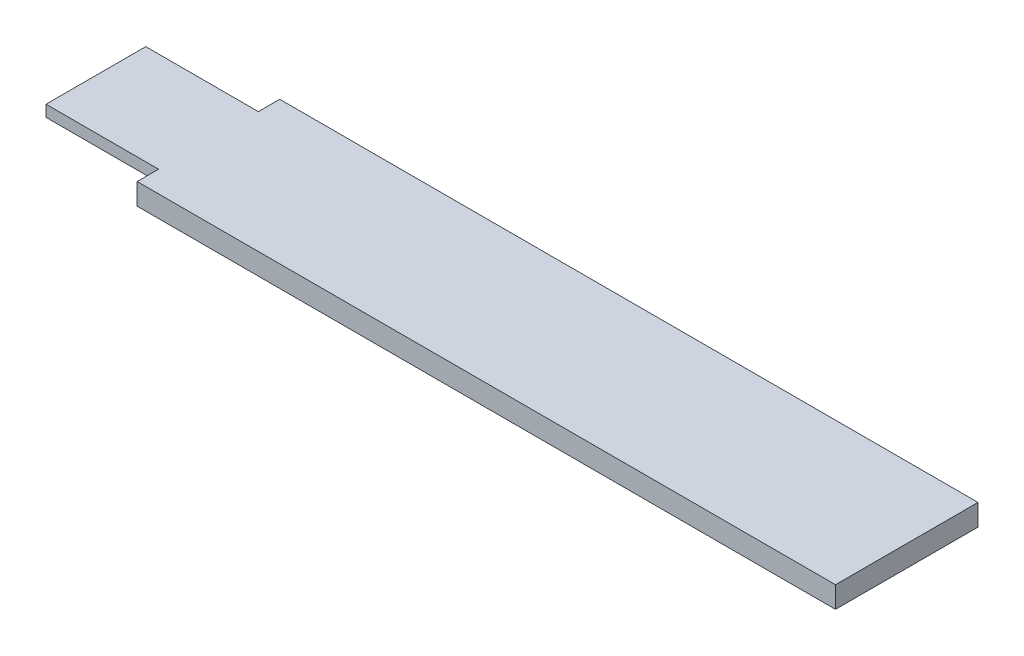
ISO-10303-21;
HEADER;
FILE_DESCRIPTION(('STEP AP214'),'2;1');
FILE_NAME('part.step','',(''),(''),'','','');
FILE_SCHEMA(('AUTOMOTIVE_DESIGN { 1 0 10303 214 1 1 1 1 }'));
ENDSEC;
DATA;
#1=APPLICATION_CONTEXT('core data for automotive mechanical design processes');
#2=APPLICATION_PROTOCOL_DEFINITION('international standard','automotive_design',2000,#1);
#3=PRODUCT_CONTEXT('',#1,'mechanical');
#4=PRODUCT('Part','Part','',(#3));
#5=PRODUCT_RELATED_PRODUCT_CATEGORY('part','',(#4));
#6=PRODUCT_DEFINITION_FORMATION('','',#4);
#7=PRODUCT_DEFINITION_CONTEXT('part definition',#1,'design');
#8=PRODUCT_DEFINITION('design','',#6,#7);
#9=PRODUCT_DEFINITION_SHAPE('','',#8);
#10=(LENGTH_UNIT() NAMED_UNIT(*) SI_UNIT(.MILLI.,.METRE.));
#11=(NAMED_UNIT(*) PLANE_ANGLE_UNIT() SI_UNIT($,.RADIAN.));
#12=(NAMED_UNIT(*) SI_UNIT($,.STERADIAN.) SOLID_ANGLE_UNIT());
#13=UNCERTAINTY_MEASURE_WITH_UNIT(LENGTH_MEASURE(1.E-05),#10,'distance_accuracy_value','');
#14=(GEOMETRIC_REPRESENTATION_CONTEXT(3) GLOBAL_UNCERTAINTY_ASSIGNED_CONTEXT((#13)) GLOBAL_UNIT_ASSIGNED_CONTEXT((#10,
#11,#12)) REPRESENTATION_CONTEXT('',''));
#15=CARTESIAN_POINT('',(0.,0.,0.));
#16=DIRECTION('',(0.,0.,1.));
#17=DIRECTION('',(1.,0.,0.));
#18=AXIS2_PLACEMENT_3D('',#15,#16,#17);
#19=CARTESIAN_POINT('',(-235.,15.,-35.));
#20=DIRECTION('',(0.,0.,1.));
#21=DIRECTION('',(1.,0.,0.));
#22=AXIS2_PLACEMENT_3D('',#19,#20,#21);
#23=PLANE('',#22);
#24=DIRECTION('',(0.,-1.,0.));
#25=VECTOR('',#24,1.);
#26=CARTESIAN_POINT('',(-235.,15.,-35.));
#27=LINE('',#26,#25);
#28=CARTESIAN_POINT('',(-235.,6.99999999999999,-35.));
#29=VERTEX_POINT('',#28);
#30=CARTESIAN_POINT('',(-235.,0.,-35.));
#31=VERTEX_POINT('',#30);
#32=EDGE_CURVE('E199',#29,#31,#27,.T.);
#33=ORIENTED_EDGE('',*,*,#32,.F.);
#34=DIRECTION('',(1.,0.,0.));
#35=VECTOR('',#34,1.);
#36=CARTESIAN_POINT('',(-324.,6.99999999999999,-35.));
#37=LINE('',#36,#35);
#38=CARTESIAN_POINT('',(-245.,6.99999999999999,-35.));
#39=VERTEX_POINT('',#38);
#40=EDGE_CURVE('E62',#39,#29,#37,.T.);
#41=ORIENTED_EDGE('',*,*,#40,.F.);
#42=DIRECTION('',(0.,-1.,0.));
#43=VECTOR('',#42,1.);
#44=CARTESIAN_POINT('',(-245.,15.,-35.));
#45=LINE('',#44,#43);
#46=CARTESIAN_POINT('',(-245.,0.,-35.));
#47=VERTEX_POINT('',#46);
#48=EDGE_CURVE('E198',#39,#47,#45,.T.);
#49=ORIENTED_EDGE('',*,*,#48,.T.);
#50=DIRECTION('',(-1.,0.,0.));
#51=VECTOR('',#50,1.);
#52=CARTESIAN_POINT('',(-235.,0.,-35.));
#53=LINE('',#52,#51);
#54=EDGE_CURVE('E191',#31,#47,#53,.T.);
#55=ORIENTED_EDGE('',*,*,#54,.F.);
#56=EDGE_LOOP('',(#33,#41,#49,#55));
#57=FACE_BOUND('',#56,.T.);
#58=ADVANCED_FACE('F45',(#57),#23,.T.);
#59=CARTESIAN_POINT('',(-235.,15.,35.));
#60=DIRECTION('',(-1.,0.,0.));
#61=DIRECTION('',(0.,0.,1.));
#62=AXIS2_PLACEMENT_3D('',#59,#60,#61);
#63=PLANE('',#62);
#64=DIRECTION('',(0.,-1.,0.));
#65=VECTOR('',#64,1.);
#66=CARTESIAN_POINT('',(-235.,15.,35.));
#67=LINE('',#66,#65);
#68=CARTESIAN_POINT('',(-235.,6.99999999999999,35.));
#69=VERTEX_POINT('',#68);
#70=CARTESIAN_POINT('',(-235.,0.,35.));
#71=VERTEX_POINT('',#70);
#72=EDGE_CURVE('E201',#69,#71,#67,.T.);
#73=ORIENTED_EDGE('',*,*,#72,.F.);
#74=DIRECTION('',(0.,0.,1.));
#75=VECTOR('',#74,1.);
#76=CARTESIAN_POINT('',(-235.,6.99999999999999,-26.3008616757819));
#77=LINE('',#76,#75);
#78=EDGE_CURVE('E70',#29,#69,#77,.T.);
#79=ORIENTED_EDGE('',*,*,#78,.F.);
#80=ORIENTED_EDGE('',*,*,#32,.T.);
#81=DIRECTION('',(0.,0.,-1.));
#82=VECTOR('',#81,1.);
#83=CARTESIAN_POINT('',(-235.,0.,35.));
#84=LINE('',#83,#82);
#85=EDGE_CURVE('E188',#71,#31,#84,.T.);
#86=ORIENTED_EDGE('',*,*,#85,.F.);
#87=EDGE_LOOP('',(#73,#79,#80,#86));
#88=FACE_BOUND('',#87,.T.);
#89=ADVANCED_FACE('F239',(#88),#63,.T.);
#90=CARTESIAN_POINT('',(-245.,15.,35.));
#91=DIRECTION('',(0.,0.,-1.));
#92=DIRECTION('',(-1.,0.,0.));
#93=AXIS2_PLACEMENT_3D('',#90,#91,#92);
#94=PLANE('',#93);
#95=DIRECTION('',(0.,-1.,0.));
#96=VECTOR('',#95,1.);
#97=CARTESIAN_POINT('',(-245.,15.,35.));
#98=LINE('',#97,#96);
#99=CARTESIAN_POINT('',(-245.,6.99999999999999,35.));
#100=VERTEX_POINT('',#99);
#101=CARTESIAN_POINT('',(-245.,0.,35.));
#102=VERTEX_POINT('',#101);
#103=EDGE_CURVE('E206',#100,#102,#98,.T.);
#104=ORIENTED_EDGE('',*,*,#103,.F.);
#105=DIRECTION('',(1.,0.,0.));
#106=VECTOR('',#105,1.);
#107=CARTESIAN_POINT('',(-324.,6.99999999999999,35.));
#108=LINE('',#107,#106);
#109=EDGE_CURVE('E153',#100,#69,#108,.T.);
#110=ORIENTED_EDGE('',*,*,#109,.T.);
#111=ORIENTED_EDGE('',*,*,#72,.T.);
#112=DIRECTION('',(1.,0.,0.));
#113=VECTOR('',#112,1.);
#114=CARTESIAN_POINT('',(-245.,0.,35.));
#115=LINE('',#114,#113);
#116=EDGE_CURVE('E185',#102,#71,#115,.T.);
#117=ORIENTED_EDGE('',*,*,#116,.F.);
#118=EDGE_LOOP('',(#104,#110,#111,#117));
#119=FACE_BOUND('',#118,.T.);
#120=ADVANCED_FACE('F237',(#119),#94,.T.);
#121=CARTESIAN_POINT('',(-245.,15.,-50.));
#122=DIRECTION('',(0.,0.,-1.));
#123=DIRECTION('',(-1.,0.,0.));
#124=AXIS2_PLACEMENT_3D('',#121,#122,#123);
#125=PLANE('',#124);
#126=DIRECTION('',(1.,0.,0.));
#127=VECTOR('',#126,1.);
#128=CARTESIAN_POINT('',(-245.,0.,-50.));
#129=LINE('',#128,#127);
#130=CARTESIAN_POINT('',(-245.,0.,-50.));
#131=VERTEX_POINT('',#130);
#132=CARTESIAN_POINT('',(245.,0.,-50.));
#133=VERTEX_POINT('',#132);
#134=EDGE_CURVE('E154',#131,#133,#129,.T.);
#135=ORIENTED_EDGE('',*,*,#134,.F.);
#136=DIRECTION('',(0.,-1.,0.));
#137=VECTOR('',#136,1.);
#138=CARTESIAN_POINT('',(-245.,15.,-50.));
#139=LINE('',#138,#137);
#140=CARTESIAN_POINT('',(-245.,15.,-50.));
#141=VERTEX_POINT('',#140);
#142=EDGE_CURVE('E11',#141,#131,#139,.T.);
#143=ORIENTED_EDGE('',*,*,#142,.F.);
#144=DIRECTION('',(1.,0.,0.));
#145=VECTOR('',#144,1.);
#146=CARTESIAN_POINT('',(-245.,15.,-50.));
#147=LINE('',#146,#145);
#148=CARTESIAN_POINT('',(245.,15.,-50.));
#149=VERTEX_POINT('',#148);
#150=EDGE_CURVE('E162',#141,#149,#147,.T.);
#151=ORIENTED_EDGE('',*,*,#150,.T.);
#152=DIRECTION('',(0.,-1.,0.));
#153=VECTOR('',#152,1.);
#154=CARTESIAN_POINT('',(245.,15.,-50.));
#155=LINE('',#154,#153);
#156=EDGE_CURVE('E49',#149,#133,#155,.T.);
#157=ORIENTED_EDGE('',*,*,#156,.T.);
#158=EDGE_LOOP('',(#135,#143,#151,#157));
#159=FACE_BOUND('',#158,.T.);
#160=ADVANCED_FACE('F47',(#159),#125,.T.);
#161=CARTESIAN_POINT('',(-245.,15.,-35.));
#162=DIRECTION('',(-1.,0.,0.));
#163=DIRECTION('',(0.,0.,1.));
#164=AXIS2_PLACEMENT_3D('',#161,#162,#163);
#165=PLANE('',#164);
#166=DIRECTION('',(0.,0.,-1.));
#167=VECTOR('',#166,1.);
#168=CARTESIAN_POINT('',(-245.,0.,-35.));
#169=LINE('',#168,#167);
#170=EDGE_CURVE('E166',#47,#131,#169,.T.);
#171=ORIENTED_EDGE('',*,*,#170,.F.);
#172=ORIENTED_EDGE('',*,*,#48,.F.);
#173=CARTESIAN_POINT('',(-245.,15.,-35.));
#174=VERTEX_POINT('',#173);
#175=EDGE_CURVE('E54',#174,#39,#45,.T.);
#176=ORIENTED_EDGE('',*,*,#175,.F.);
#177=DIRECTION('',(0.,0.,-1.));
#178=VECTOR('',#177,1.);
#179=CARTESIAN_POINT('',(-245.,15.,-35.));
#180=LINE('',#179,#178);
#181=EDGE_CURVE('E174',#174,#141,#180,.T.);
#182=ORIENTED_EDGE('',*,*,#181,.T.);
#183=ORIENTED_EDGE('',*,*,#142,.T.);
#184=EDGE_LOOP('',(#171,#172,#176,#182,#183));
#185=FACE_BOUND('',#184,.T.);
#186=ADVANCED_FACE('F222',(#185),#165,.T.);
#187=CARTESIAN_POINT('',(-245.,15.,50.));
#188=DIRECTION('',(-1.,0.,0.));
#189=DIRECTION('',(0.,0.,1.));
#190=AXIS2_PLACEMENT_3D('',#187,#188,#189);
#191=PLANE('',#190);
#192=DIRECTION('',(0.,0.,-1.));
#193=VECTOR('',#192,1.);
#194=CARTESIAN_POINT('',(-245.,0.,50.));
#195=LINE('',#194,#193);
#196=CARTESIAN_POINT('',(-245.,0.,50.));
#197=VERTEX_POINT('',#196);
#198=EDGE_CURVE('E182',#197,#102,#195,.T.);
#199=ORIENTED_EDGE('',*,*,#198,.F.);
#200=DIRECTION('',(0.,-1.,0.));
#201=VECTOR('',#200,1.);
#202=CARTESIAN_POINT('',(-245.,15.,50.));
#203=LINE('',#202,#201);
#204=CARTESIAN_POINT('',(-245.,15.,50.));
#205=VERTEX_POINT('',#204);
#206=EDGE_CURVE('E207',#205,#197,#203,.T.);
#207=ORIENTED_EDGE('',*,*,#206,.F.);
#208=DIRECTION('',(0.,0.,-1.));
#209=VECTOR('',#208,1.);
#210=CARTESIAN_POINT('',(-245.,15.,50.));
#211=LINE('',#210,#209);
#212=CARTESIAN_POINT('',(-245.,15.,35.));
#213=VERTEX_POINT('',#212);
#214=EDGE_CURVE('E172',#205,#213,#211,.T.);
#215=ORIENTED_EDGE('',*,*,#214,.T.);
#216=EDGE_CURVE('E203',#213,#100,#98,.T.);
#217=ORIENTED_EDGE('',*,*,#216,.T.);
#218=ORIENTED_EDGE('',*,*,#103,.T.);
#219=EDGE_LOOP('',(#199,#207,#215,#217,#218));
#220=FACE_BOUND('',#219,.T.);
#221=ADVANCED_FACE('F235',(#220),#191,.T.);
#222=CARTESIAN_POINT('',(245.,15.,50.));
#223=DIRECTION('',(0.,0.,1.));
#224=DIRECTION('',(1.,0.,0.));
#225=AXIS2_PLACEMENT_3D('',#222,#223,#224);
#226=PLANE('',#225);
#227=DIRECTION('',(-1.,0.,0.));
#228=VECTOR('',#227,1.);
#229=CARTESIAN_POINT('',(245.,0.,50.));
#230=LINE('',#229,#228);
#231=CARTESIAN_POINT('',(245.,0.,50.));
#232=VERTEX_POINT('',#231);
#233=EDGE_CURVE('E179',#232,#197,#230,.T.);
#234=ORIENTED_EDGE('',*,*,#233,.F.);
#235=DIRECTION('',(0.,-1.,0.));
#236=VECTOR('',#235,1.);
#237=CARTESIAN_POINT('',(245.,15.,50.));
#238=LINE('',#237,#236);
#239=CARTESIAN_POINT('',(245.,15.,50.));
#240=VERTEX_POINT('',#239);
#241=EDGE_CURVE('E208',#240,#232,#238,.T.);
#242=ORIENTED_EDGE('',*,*,#241,.F.);
#243=DIRECTION('',(-1.,0.,0.));
#244=VECTOR('',#243,1.);
#245=CARTESIAN_POINT('',(245.,15.,50.));
#246=LINE('',#245,#244);
#247=EDGE_CURVE('E169',#240,#205,#246,.T.);
#248=ORIENTED_EDGE('',*,*,#247,.T.);
#249=ORIENTED_EDGE('',*,*,#206,.T.);
#250=EDGE_LOOP('',(#234,#242,#248,#249));
#251=FACE_BOUND('',#250,.T.);
#252=ADVANCED_FACE('F231',(#251),#226,.T.);
#253=CARTESIAN_POINT('',(245.,15.,-50.));
#254=DIRECTION('',(1.,0.,0.));
#255=DIRECTION('',(0.,0.,-1.));
#256=AXIS2_PLACEMENT_3D('',#253,#254,#255);
#257=PLANE('',#256);
#258=DIRECTION('',(0.,0.,1.));
#259=VECTOR('',#258,1.);
#260=CARTESIAN_POINT('',(245.,0.,-50.));
#261=LINE('',#260,#259);
#262=EDGE_CURVE('E157',#133,#232,#261,.T.);
#263=ORIENTED_EDGE('',*,*,#262,.F.);
#264=ORIENTED_EDGE('',*,*,#156,.F.);
#265=DIRECTION('',(0.,0.,1.));
#266=VECTOR('',#265,1.);
#267=CARTESIAN_POINT('',(245.,15.,-50.));
#268=LINE('',#267,#266);
#269=EDGE_CURVE('E165',#149,#240,#268,.T.);
#270=ORIENTED_EDGE('',*,*,#269,.T.);
#271=ORIENTED_EDGE('',*,*,#241,.T.);
#272=EDGE_LOOP('',(#263,#264,#270,#271));
#273=FACE_BOUND('',#272,.T.);
#274=ADVANCED_FACE('F216',(#273),#257,.T.);
#275=CARTESIAN_POINT('',(0.,15.,0.));
#276=DIRECTION('',(0.,-1.,0.));
#277=DIRECTION('',(0.,0.,-1.));
#278=AXIS2_PLACEMENT_3D('',#275,#276,#277);
#279=PLANE('',#278);
#280=ORIENTED_EDGE('',*,*,#181,.F.);
#281=DIRECTION('',(1.,0.,0.));
#282=VECTOR('',#281,1.);
#283=CARTESIAN_POINT('',(-324.,15.,-35.));
#284=LINE('',#283,#282);
#285=CARTESIAN_POINT('',(-324.,15.,-35.));
#286=VERTEX_POINT('',#285);
#287=EDGE_CURVE('E423',#286,#174,#284,.T.);
#288=ORIENTED_EDGE('',*,*,#287,.F.);
#289=DIRECTION('',(0.,0.,-1.));
#290=VECTOR('',#289,1.);
#291=CARTESIAN_POINT('',(-324.,15.,35.));
#292=LINE('',#291,#290);
#293=CARTESIAN_POINT('',(-324.,15.,35.));
#294=VERTEX_POINT('',#293);
#295=EDGE_CURVE('E140',#294,#286,#292,.T.);
#296=ORIENTED_EDGE('',*,*,#295,.F.);
#297=DIRECTION('',(1.,0.,0.));
#298=VECTOR('',#297,1.);
#299=CARTESIAN_POINT('',(-324.,15.,35.));
#300=LINE('',#299,#298);
#301=EDGE_CURVE('E137',#294,#213,#300,.T.);
#302=ORIENTED_EDGE('',*,*,#301,.T.);
#303=ORIENTED_EDGE('',*,*,#214,.F.);
#304=ORIENTED_EDGE('',*,*,#247,.F.);
#305=ORIENTED_EDGE('',*,*,#269,.F.);
#306=ORIENTED_EDGE('',*,*,#150,.F.);
#307=EDGE_LOOP('',(#280,#288,#296,#302,#303,#304,#305,#306));
#308=FACE_BOUND('',#307,.T.);
#309=ADVANCED_FACE('F225',(#308),#279,.F.);
#310=CARTESIAN_POINT('',(0.,0.,0.));
#311=DIRECTION('',(0.,-1.,0.));
#312=DIRECTION('',(0.,0.,-1.));
#313=AXIS2_PLACEMENT_3D('',#310,#311,#312);
#314=PLANE('',#313);
#315=ORIENTED_EDGE('',*,*,#134,.T.);
#316=ORIENTED_EDGE('',*,*,#262,.T.);
#317=ORIENTED_EDGE('',*,*,#233,.T.);
#318=ORIENTED_EDGE('',*,*,#198,.T.);
#319=ORIENTED_EDGE('',*,*,#116,.T.);
#320=ORIENTED_EDGE('',*,*,#85,.T.);
#321=ORIENTED_EDGE('',*,*,#54,.T.);
#322=ORIENTED_EDGE('',*,*,#170,.T.);
#323=EDGE_LOOP('',(#315,#316,#317,#318,#319,#320,#321,#322));
#324=FACE_BOUND('',#323,.T.);
#325=ADVANCED_FACE('F218',(#324),#314,.T.);
#326=CARTESIAN_POINT('',(-324.,6.99999999999999,35.));
#327=DIRECTION('',(0.,0.,-1.));
#328=DIRECTION('',(-1.,0.,0.));
#329=AXIS2_PLACEMENT_3D('',#326,#327,#328);
#330=PLANE('',#329);
#331=ORIENTED_EDGE('',*,*,#216,.F.);
#332=ORIENTED_EDGE('',*,*,#301,.F.);
#333=DIRECTION('',(0.,1.,0.));
#334=VECTOR('',#333,1.);
#335=CARTESIAN_POINT('',(-324.,6.99999999999999,35.));
#336=LINE('',#335,#334);
#337=CARTESIAN_POINT('',(-324.,6.99999999999999,35.));
#338=VERTEX_POINT('',#337);
#339=EDGE_CURVE('E130',#338,#294,#336,.T.);
#340=ORIENTED_EDGE('',*,*,#339,.F.);
#341=EDGE_CURVE('E135',#338,#100,#108,.T.);
#342=ORIENTED_EDGE('',*,*,#341,.T.);
#343=EDGE_LOOP('',(#331,#332,#340,#342));
#344=FACE_BOUND('',#343,.T.);
#345=ADVANCED_FACE('F133',(#344),#330,.F.);
#346=CARTESIAN_POINT('',(-324.,15.,-35.));
#347=DIRECTION('',(0.,0.,1.));
#348=DIRECTION('',(1.,0.,0.));
#349=AXIS2_PLACEMENT_3D('',#346,#347,#348);
#350=PLANE('',#349);
#351=ORIENTED_EDGE('',*,*,#175,.T.);
#352=CARTESIAN_POINT('',(-324.,6.99999999999999,-35.));
#353=VERTEX_POINT('',#352);
#354=EDGE_CURVE('E422',#353,#39,#37,.T.);
#355=ORIENTED_EDGE('',*,*,#354,.F.);
#356=DIRECTION('',(0.,-1.,0.));
#357=VECTOR('',#356,1.);
#358=CARTESIAN_POINT('',(-324.,15.,-35.));
#359=LINE('',#358,#357);
#360=EDGE_CURVE('E146',#286,#353,#359,.T.);
#361=ORIENTED_EDGE('',*,*,#360,.F.);
#362=ORIENTED_EDGE('',*,*,#287,.T.);
#363=EDGE_LOOP('',(#351,#355,#361,#362));
#364=FACE_BOUND('',#363,.T.);
#365=ADVANCED_FACE('F268',(#364),#350,.F.);
#366=CARTESIAN_POINT('',(-324.,6.99999999999999,-26.3008616757819));
#367=DIRECTION('',(0.,1.,0.));
#368=DIRECTION('',(0.,0.,1.));
#369=AXIS2_PLACEMENT_3D('',#366,#367,#368);
#370=PLANE('',#369);
#371=ORIENTED_EDGE('',*,*,#78,.T.);
#372=ORIENTED_EDGE('',*,*,#109,.F.);
#373=ORIENTED_EDGE('',*,*,#341,.F.);
#374=DIRECTION('',(0.,0.,1.));
#375=VECTOR('',#374,1.);
#376=CARTESIAN_POINT('',(-324.,6.99999999999999,-26.3008616757819));
#377=LINE('',#376,#375);
#378=EDGE_CURVE('E141',#353,#338,#377,.T.);
#379=ORIENTED_EDGE('',*,*,#378,.F.);
#380=ORIENTED_EDGE('',*,*,#354,.T.);
#381=ORIENTED_EDGE('',*,*,#40,.T.);
#382=EDGE_LOOP('',(#371,#372,#373,#379,#380,#381));
#383=FACE_BOUND('',#382,.T.);
#384=ADVANCED_FACE('F152',(#383),#370,.F.);
#385=CARTESIAN_POINT('',(-324.,0.,0.));
#386=DIRECTION('',(-1.,0.,0.));
#387=DIRECTION('',(0.,0.,1.));
#388=AXIS2_PLACEMENT_3D('',#385,#386,#387);
#389=PLANE('',#388);
#390=ORIENTED_EDGE('',*,*,#378,.T.);
#391=ORIENTED_EDGE('',*,*,#339,.T.);
#392=ORIENTED_EDGE('',*,*,#295,.T.);
#393=ORIENTED_EDGE('',*,*,#360,.T.);
#394=EDGE_LOOP('',(#390,#391,#392,#393));
#395=FACE_BOUND('',#394,.T.);
#396=ADVANCED_FACE('F144',(#395),#389,.T.);
#397=CLOSED_SHELL('',(#58,#89,#120,#160,#186,#221,#252,#274,#309,#325,#345,#365,#384,#396));
#398=MANIFOLD_SOLID_BREP('B2',#397);
#399=ADVANCED_BREP_SHAPE_REPRESENTATION('',(#18,#398),#14);
#400=SHAPE_DEFINITION_REPRESENTATION(#9,#399);
ENDSEC;
END-ISO-10303-21;
